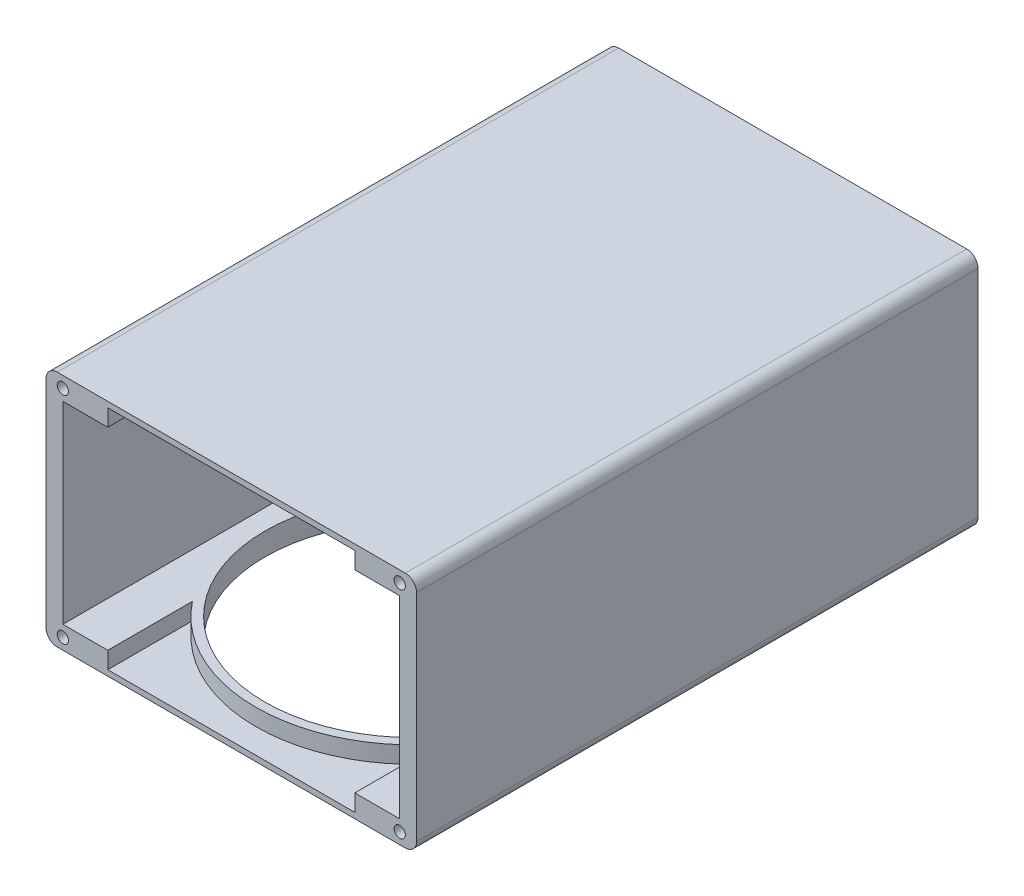
ISO-10303-21;
HEADER;
FILE_DESCRIPTION(('STEP AP214'),'2;1');
FILE_NAME('part.step','',(''),(''),'','','');
FILE_SCHEMA(('AUTOMOTIVE_DESIGN { 1 0 10303 214 1 1 1 1 }'));
ENDSEC;
DATA;
#1=APPLICATION_CONTEXT('core data for automotive mechanical design processes');
#2=APPLICATION_PROTOCOL_DEFINITION('international standard','automotive_design',2000,#1);
#3=PRODUCT_CONTEXT('',#1,'mechanical');
#4=PRODUCT('Part','Part','',(#3));
#5=PRODUCT_RELATED_PRODUCT_CATEGORY('part','',(#4));
#6=PRODUCT_DEFINITION_FORMATION('','',#4);
#7=PRODUCT_DEFINITION_CONTEXT('part definition',#1,'design');
#8=PRODUCT_DEFINITION('design','',#6,#7);
#9=PRODUCT_DEFINITION_SHAPE('','',#8);
#10=(LENGTH_UNIT() NAMED_UNIT(*) SI_UNIT(.MILLI.,.METRE.));
#11=(NAMED_UNIT(*) PLANE_ANGLE_UNIT() SI_UNIT($,.RADIAN.));
#12=(NAMED_UNIT(*) SI_UNIT($,.STERADIAN.) SOLID_ANGLE_UNIT());
#13=UNCERTAINTY_MEASURE_WITH_UNIT(LENGTH_MEASURE(1.E-05),#10,'distance_accuracy_value','');
#14=(GEOMETRIC_REPRESENTATION_CONTEXT(3) GLOBAL_UNCERTAINTY_ASSIGNED_CONTEXT((#13)) GLOBAL_UNIT_ASSIGNED_CONTEXT((#10,
#11,#12)) REPRESENTATION_CONTEXT('',''));
#15=CARTESIAN_POINT('',(0.,0.,0.));
#16=DIRECTION('',(0.,0.,1.));
#17=DIRECTION('',(1.,0.,0.));
#18=AXIS2_PLACEMENT_3D('',#15,#16,#17);
#19=CARTESIAN_POINT('',(0.,0.,0.));
#20=DIRECTION('',(0.,0.,1.));
#21=DIRECTION('',(1.,0.,0.));
#22=AXIS2_PLACEMENT_3D('',#19,#20,#21);
#23=PLANE('',#22);
#24=CARTESIAN_POINT('',(152.5,-4.99999999999999,0.));
#25=DIRECTION('',(0.,0.,1.));
#26=DIRECTION('',(1.,0.,0.));
#27=AXIS2_PLACEMENT_3D('',#24,#25,#26);
#28=CIRCLE('',#27,5.);
#29=CARTESIAN_POINT('',(152.5,-9.99999999999999,0.));
#30=VERTEX_POINT('',#29);
#31=CARTESIAN_POINT('',(157.5,-4.99999999999999,0.));
#32=VERTEX_POINT('',#31);
#33=EDGE_CURVE('E263',#30,#32,#28,.T.);
#34=ORIENTED_EDGE('',*,*,#33,.T.);
#35=DIRECTION('',(0.,1.,0.));
#36=VECTOR('',#35,1.);
#37=CARTESIAN_POINT('',(157.5,0.,0.));
#38=LINE('',#37,#36);
#39=CARTESIAN_POINT('',(157.5,91.,0.));
#40=VERTEX_POINT('',#39);
#41=EDGE_CURVE('E310',#32,#40,#38,.T.);
#42=ORIENTED_EDGE('',*,*,#41,.T.);
#43=CARTESIAN_POINT('',(152.5,91.,0.));
#44=DIRECTION('',(0.,0.,1.));
#45=DIRECTION('',(1.,0.,0.));
#46=AXIS2_PLACEMENT_3D('',#43,#44,#45);
#47=CIRCLE('',#46,5.);
#48=CARTESIAN_POINT('',(152.5,96.,0.));
#49=VERTEX_POINT('',#48);
#50=EDGE_CURVE('E420',#40,#49,#47,.T.);
#51=ORIENTED_EDGE('',*,*,#50,.T.);
#52=DIRECTION('',(1.,0.,0.));
#53=VECTOR('',#52,1.);
#54=CARTESIAN_POINT('',(0.,96.,0.));
#55=LINE('',#54,#53);
#56=CARTESIAN_POINT('',(-2.5,96.,0.));
#57=VERTEX_POINT('',#56);
#58=EDGE_CURVE('E362',#57,#49,#55,.T.);
#59=ORIENTED_EDGE('',*,*,#58,.F.);
#60=CARTESIAN_POINT('',(-2.5,91.,0.));
#61=DIRECTION('',(0.,0.,1.));
#62=DIRECTION('',(1.,0.,0.));
#63=AXIS2_PLACEMENT_3D('',#60,#61,#62);
#64=CIRCLE('',#63,5.);
#65=CARTESIAN_POINT('',(-7.5,91.,0.));
#66=VERTEX_POINT('',#65);
#67=EDGE_CURVE('E423',#57,#66,#64,.T.);
#68=ORIENTED_EDGE('',*,*,#67,.T.);
#69=DIRECTION('',(0.,1.,0.));
#70=VECTOR('',#69,1.);
#71=CARTESIAN_POINT('',(-7.5,0.,0.));
#72=LINE('',#71,#70);
#73=CARTESIAN_POINT('',(-7.5,-5.,0.));
#74=VERTEX_POINT('',#73);
#75=EDGE_CURVE('E366',#74,#66,#72,.T.);
#76=ORIENTED_EDGE('',*,*,#75,.F.);
#77=CARTESIAN_POINT('',(-2.5,-5.,0.));
#78=DIRECTION('',(0.,0.,1.));
#79=DIRECTION('',(1.,0.,0.));
#80=AXIS2_PLACEMENT_3D('',#77,#78,#79);
#81=CIRCLE('',#80,5.);
#82=CARTESIAN_POINT('',(-2.5,-10.,0.));
#83=VERTEX_POINT('',#82);
#84=EDGE_CURVE('E268',#74,#83,#81,.T.);
#85=ORIENTED_EDGE('',*,*,#84,.T.);
#86=DIRECTION('',(-1.,0.,0.));
#87=VECTOR('',#86,1.);
#88=CARTESIAN_POINT('',(0.,-10.,0.));
#89=LINE('',#88,#87);
#90=EDGE_CURVE('E452',#30,#83,#89,.T.);
#91=ORIENTED_EDGE('',*,*,#90,.F.);
#92=EDGE_LOOP('',(#34,#42,#51,#59,#68,#76,#85,#91));
#93=FACE_BOUND('',#92,.T.);
#94=CARTESIAN_POINT('',(150.,91.,0.));
#95=DIRECTION('',(0.,0.,-1.));
#96=DIRECTION('',(-1.,0.,0.));
#97=AXIS2_PLACEMENT_3D('',#94,#95,#96);
#98=CIRCLE('',#97,2.5);
#99=CARTESIAN_POINT('',(147.5,91.,0.));
#100=VERTEX_POINT('',#99);
#101=EDGE_CURVE('E299',#100,#100,#98,.T.);
#102=ORIENTED_EDGE('',*,*,#101,.T.);
#103=EDGE_LOOP('',(#102));
#104=FACE_BOUND('',#103,.T.);
#105=DIRECTION('',(0.,1.,0.));
#106=VECTOR('',#105,1.);
#107=CARTESIAN_POINT('',(150.,0.,0.));
#108=LINE('',#107,#106);
#109=CARTESIAN_POINT('',(150.,0.,0.));
#110=VERTEX_POINT('',#109);
#111=CARTESIAN_POINT('',(150.,86.,0.));
#112=VERTEX_POINT('',#111);
#113=EDGE_CURVE('E326',#110,#112,#108,.T.);
#114=ORIENTED_EDGE('',*,*,#113,.F.);
#115=DIRECTION('',(1.,0.,0.));
#116=VECTOR('',#115,1.);
#117=CARTESIAN_POINT('',(0.,0.,0.));
#118=LINE('',#117,#116);
#119=CARTESIAN_POINT('',(130.,0.,0.));
#120=VERTEX_POINT('',#119);
#121=EDGE_CURVE('E459',#120,#110,#118,.T.);
#122=ORIENTED_EDGE('',*,*,#121,.F.);
#123=DIRECTION('',(0.,1.,0.));
#124=VECTOR('',#123,1.);
#125=CARTESIAN_POINT('',(130.,0.,0.));
#126=LINE('',#125,#124);
#127=CARTESIAN_POINT('',(130.,-7.49999999999999,0.));
#128=VERTEX_POINT('',#127);
#129=EDGE_CURVE('E465',#128,#120,#126,.T.);
#130=ORIENTED_EDGE('',*,*,#129,.F.);
#131=DIRECTION('',(1.,0.,0.));
#132=VECTOR('',#131,1.);
#133=CARTESIAN_POINT('',(0.,-7.5,0.));
#134=LINE('',#133,#132);
#135=CARTESIAN_POINT('',(20.,-7.5,0.));
#136=VERTEX_POINT('',#135);
#137=EDGE_CURVE('E478',#136,#128,#134,.T.);
#138=ORIENTED_EDGE('',*,*,#137,.F.);
#139=DIRECTION('',(0.,1.,0.));
#140=VECTOR('',#139,1.);
#141=CARTESIAN_POINT('',(20.,0.,0.));
#142=LINE('',#141,#140);
#143=CARTESIAN_POINT('',(20.,0.,0.));
#144=VERTEX_POINT('',#143);
#145=EDGE_CURVE('E482',#136,#144,#142,.T.);
#146=ORIENTED_EDGE('',*,*,#145,.T.);
#147=CARTESIAN_POINT('',(0.,0.,0.));
#148=VERTEX_POINT('',#147);
#149=EDGE_CURVE('E467',#148,#144,#118,.T.);
#150=ORIENTED_EDGE('',*,*,#149,.F.);
#151=DIRECTION('',(0.,1.,0.));
#152=VECTOR('',#151,1.);
#153=CARTESIAN_POINT('',(0.,0.,0.));
#154=LINE('',#153,#152);
#155=CARTESIAN_POINT('',(0.,86.,0.));
#156=VERTEX_POINT('',#155);
#157=EDGE_CURVE('E369',#148,#156,#154,.T.);
#158=ORIENTED_EDGE('',*,*,#157,.T.);
#159=DIRECTION('',(1.,0.,0.));
#160=VECTOR('',#159,1.);
#161=CARTESIAN_POINT('',(0.,86.,0.));
#162=LINE('',#161,#160);
#163=CARTESIAN_POINT('',(20.,86.,0.));
#164=VERTEX_POINT('',#163);
#165=EDGE_CURVE('E373',#156,#164,#162,.T.);
#166=ORIENTED_EDGE('',*,*,#165,.T.);
#167=DIRECTION('',(0.,-1.,0.));
#168=VECTOR('',#167,1.);
#169=CARTESIAN_POINT('',(20.,0.,0.));
#170=LINE('',#169,#168);
#171=CARTESIAN_POINT('',(20.,93.5,0.));
#172=VERTEX_POINT('',#171);
#173=EDGE_CURVE('E377',#172,#164,#170,.T.);
#174=ORIENTED_EDGE('',*,*,#173,.F.);
#175=DIRECTION('',(1.,0.,0.));
#176=VECTOR('',#175,1.);
#177=CARTESIAN_POINT('',(0.,93.5,0.));
#178=LINE('',#177,#176);
#179=CARTESIAN_POINT('',(130.,93.5,0.));
#180=VERTEX_POINT('',#179);
#181=EDGE_CURVE('E381',#172,#180,#178,.T.);
#182=ORIENTED_EDGE('',*,*,#181,.T.);
#183=DIRECTION('',(0.,-1.,0.));
#184=VECTOR('',#183,1.);
#185=CARTESIAN_POINT('',(130.,0.,0.));
#186=LINE('',#185,#184);
#187=CARTESIAN_POINT('',(130.,86.,0.));
#188=VERTEX_POINT('',#187);
#189=EDGE_CURVE('E385',#180,#188,#186,.T.);
#190=ORIENTED_EDGE('',*,*,#189,.T.);
#191=DIRECTION('',(1.,0.,0.));
#192=VECTOR('',#191,1.);
#193=CARTESIAN_POINT('',(0.,86.,0.));
#194=LINE('',#193,#192);
#195=EDGE_CURVE('E389',#188,#112,#194,.T.);
#196=ORIENTED_EDGE('',*,*,#195,.T.);
#197=EDGE_LOOP('',(#114,#122,#130,#138,#146,#150,#158,#166,#174,#182,#190,#196));
#198=FACE_BOUND('',#197,.T.);
#199=CARTESIAN_POINT('',(0.,91.,0.));
#200=DIRECTION('',(0.,0.,1.));
#201=DIRECTION('',(1.,0.,0.));
#202=AXIS2_PLACEMENT_3D('',#199,#200,#201);
#203=CIRCLE('',#202,2.5);
#204=CARTESIAN_POINT('',(2.5,91.,0.));
#205=VERTEX_POINT('',#204);
#206=EDGE_CURVE('E295',#205,#205,#203,.T.);
#207=ORIENTED_EDGE('',*,*,#206,.F.);
#208=EDGE_LOOP('',(#207));
#209=FACE_BOUND('',#208,.T.);
#210=CARTESIAN_POINT('',(150.,-5.,0.));
#211=DIRECTION('',(0.,0.,1.));
#212=DIRECTION('',(1.,0.,0.));
#213=AXIS2_PLACEMENT_3D('',#210,#211,#212);
#214=CIRCLE('',#213,2.5);
#215=CARTESIAN_POINT('',(152.5,-5.,0.));
#216=VERTEX_POINT('',#215);
#217=EDGE_CURVE('E577',#216,#216,#214,.T.);
#218=ORIENTED_EDGE('',*,*,#217,.F.);
#219=EDGE_LOOP('',(#218));
#220=FACE_BOUND('',#219,.T.);
#221=CARTESIAN_POINT('',(0.,-5.,0.));
#222=DIRECTION('',(0.,0.,-1.));
#223=DIRECTION('',(-1.,0.,0.));
#224=AXIS2_PLACEMENT_3D('',#221,#222,#223);
#225=CIRCLE('',#224,2.5);
#226=CARTESIAN_POINT('',(-2.5,-5.,0.));
#227=VERTEX_POINT('',#226);
#228=EDGE_CURVE('E562',#227,#227,#225,.T.);
#229=ORIENTED_EDGE('',*,*,#228,.T.);
#230=EDGE_LOOP('',(#229));
#231=FACE_BOUND('',#230,.T.);
#232=ADVANCED_FACE('F49',(#93,#104,#198,#209,#220,#231),#23,.T.);
#233=CARTESIAN_POINT('',(150.,0.,-250.));
#234=DIRECTION('',(1.,0.,0.));
#235=DIRECTION('',(0.,0.,-1.));
#236=AXIS2_PLACEMENT_3D('',#233,#234,#235);
#237=PLANE('',#236);
#238=ORIENTED_EDGE('',*,*,#113,.T.);
#239=DIRECTION('',(0.,0.,1.));
#240=VECTOR('',#239,1.);
#241=CARTESIAN_POINT('',(150.,86.,-250.));
#242=LINE('',#241,#240);
#243=CARTESIAN_POINT('',(150.,86.,-250.));
#244=VERTEX_POINT('',#243);
#245=EDGE_CURVE('E396',#244,#112,#242,.T.);
#246=ORIENTED_EDGE('',*,*,#245,.F.);
#247=DIRECTION('',(0.,1.,0.));
#248=VECTOR('',#247,1.);
#249=CARTESIAN_POINT('',(150.,0.,-250.));
#250=LINE('',#249,#248);
#251=CARTESIAN_POINT('',(150.,0.,-250.));
#252=VERTEX_POINT('',#251);
#253=EDGE_CURVE('E355',#252,#244,#250,.T.);
#254=ORIENTED_EDGE('',*,*,#253,.F.);
#255=DIRECTION('',(0.,0.,1.));
#256=VECTOR('',#255,1.);
#257=CARTESIAN_POINT('',(150.,0.,-250.));
#258=LINE('',#257,#256);
#259=EDGE_CURVE('E252',#252,#110,#258,.T.);
#260=ORIENTED_EDGE('',*,*,#259,.T.);
#261=EDGE_LOOP('',(#238,#246,#254,#260));
#262=FACE_BOUND('',#261,.T.);
#263=ADVANCED_FACE('F606',(#262),#237,.F.);
#264=CARTESIAN_POINT('',(0.,86.,-250.));
#265=DIRECTION('',(0.,-1.,0.));
#266=DIRECTION('',(0.,0.,-1.));
#267=AXIS2_PLACEMENT_3D('',#264,#265,#266);
#268=PLANE('',#267);
#269=ORIENTED_EDGE('',*,*,#195,.F.);
#270=DIRECTION('',(0.,0.,1.));
#271=VECTOR('',#270,1.);
#272=CARTESIAN_POINT('',(130.,86.,-250.));
#273=LINE('',#272,#271);
#274=CARTESIAN_POINT('',(130.,86.,-250.));
#275=VERTEX_POINT('',#274);
#276=EDGE_CURVE('E400',#275,#188,#273,.T.);
#277=ORIENTED_EDGE('',*,*,#276,.F.);
#278=DIRECTION('',(1.,0.,0.));
#279=VECTOR('',#278,1.);
#280=CARTESIAN_POINT('',(0.,86.,-250.));
#281=LINE('',#280,#279);
#282=EDGE_CURVE('E351',#275,#244,#281,.T.);
#283=ORIENTED_EDGE('',*,*,#282,.T.);
#284=ORIENTED_EDGE('',*,*,#245,.T.);
#285=EDGE_LOOP('',(#269,#277,#283,#284));
#286=FACE_BOUND('',#285,.T.);
#287=ADVANCED_FACE('F612',(#286),#268,.T.);
#288=CARTESIAN_POINT('',(130.,0.,-250.));
#289=DIRECTION('',(-1.,0.,0.));
#290=DIRECTION('',(0.,0.,1.));
#291=AXIS2_PLACEMENT_3D('',#288,#289,#290);
#292=PLANE('',#291);
#293=ORIENTED_EDGE('',*,*,#189,.F.);
#294=DIRECTION('',(0.,0.,1.));
#295=VECTOR('',#294,1.);
#296=CARTESIAN_POINT('',(130.,93.5,-250.));
#297=LINE('',#296,#295);
#298=CARTESIAN_POINT('',(130.,93.5,-250.));
#299=VERTEX_POINT('',#298);
#300=EDGE_CURVE('E403',#299,#180,#297,.T.);
#301=ORIENTED_EDGE('',*,*,#300,.F.);
#302=DIRECTION('',(0.,-1.,0.));
#303=VECTOR('',#302,1.);
#304=CARTESIAN_POINT('',(130.,0.,-250.));
#305=LINE('',#304,#303);
#306=EDGE_CURVE('E347',#299,#275,#305,.T.);
#307=ORIENTED_EDGE('',*,*,#306,.T.);
#308=ORIENTED_EDGE('',*,*,#276,.T.);
#309=EDGE_LOOP('',(#293,#301,#307,#308));
#310=FACE_BOUND('',#309,.T.);
#311=ADVANCED_FACE('F620',(#310),#292,.T.);
#312=CARTESIAN_POINT('',(0.,93.5,-250.));
#313=DIRECTION('',(0.,-1.,0.));
#314=DIRECTION('',(1.,0.,0.));
#315=AXIS2_PLACEMENT_3D('',#312,#313,#314);
#316=PLANE('',#315);
#317=ORIENTED_EDGE('',*,*,#181,.F.);
#318=DIRECTION('',(0.,0.,1.));
#319=VECTOR('',#318,1.);
#320=CARTESIAN_POINT('',(20.,93.5,-250.));
#321=LINE('',#320,#319);
#322=CARTESIAN_POINT('',(20.,93.5,-250.));
#323=VERTEX_POINT('',#322);
#324=EDGE_CURVE('E406',#323,#172,#321,.T.);
#325=ORIENTED_EDGE('',*,*,#324,.F.);
#326=DIRECTION('',(1.,0.,0.));
#327=VECTOR('',#326,1.);
#328=CARTESIAN_POINT('',(0.,93.5,-250.));
#329=LINE('',#328,#327);
#330=EDGE_CURVE('E343',#323,#299,#329,.T.);
#331=ORIENTED_EDGE('',*,*,#330,.T.);
#332=ORIENTED_EDGE('',*,*,#300,.T.);
#333=EDGE_LOOP('',(#317,#325,#331,#332));
#334=FACE_BOUND('',#333,.T.);
#335=ADVANCED_FACE('F624',(#334),#316,.T.);
#336=CARTESIAN_POINT('',(20.,0.,-250.));
#337=DIRECTION('',(-1.,0.,0.));
#338=DIRECTION('',(0.,0.,1.));
#339=AXIS2_PLACEMENT_3D('',#336,#337,#338);
#340=PLANE('',#339);
#341=ORIENTED_EDGE('',*,*,#173,.T.);
#342=DIRECTION('',(0.,0.,1.));
#343=VECTOR('',#342,1.);
#344=CARTESIAN_POINT('',(20.,86.,-250.));
#345=LINE('',#344,#343);
#346=CARTESIAN_POINT('',(20.,86.,-250.));
#347=VERTEX_POINT('',#346);
#348=EDGE_CURVE('E409',#347,#164,#345,.T.);
#349=ORIENTED_EDGE('',*,*,#348,.F.);
#350=DIRECTION('',(0.,-1.,0.));
#351=VECTOR('',#350,1.);
#352=CARTESIAN_POINT('',(20.,0.,-250.));
#353=LINE('',#352,#351);
#354=EDGE_CURVE('E340',#323,#347,#353,.T.);
#355=ORIENTED_EDGE('',*,*,#354,.F.);
#356=ORIENTED_EDGE('',*,*,#324,.T.);
#357=EDGE_LOOP('',(#341,#349,#355,#356));
#358=FACE_BOUND('',#357,.T.);
#359=ADVANCED_FACE('F628',(#358),#340,.F.);
#360=CARTESIAN_POINT('',(0.,86.,-250.));
#361=DIRECTION('',(0.,-1.,0.));
#362=DIRECTION('',(0.,0.,-1.));
#363=AXIS2_PLACEMENT_3D('',#360,#361,#362);
#364=PLANE('',#363);
#365=ORIENTED_EDGE('',*,*,#165,.F.);
#366=DIRECTION('',(0.,0.,1.));
#367=VECTOR('',#366,1.);
#368=CARTESIAN_POINT('',(0.,86.,-250.));
#369=LINE('',#368,#367);
#370=CARTESIAN_POINT('',(0.,86.,-250.));
#371=VERTEX_POINT('',#370);
#372=EDGE_CURVE('E358',#371,#156,#369,.T.);
#373=ORIENTED_EDGE('',*,*,#372,.F.);
#374=DIRECTION('',(1.,0.,0.));
#375=VECTOR('',#374,1.);
#376=CARTESIAN_POINT('',(0.,86.,-250.));
#377=LINE('',#376,#375);
#378=EDGE_CURVE('E336',#371,#347,#377,.T.);
#379=ORIENTED_EDGE('',*,*,#378,.T.);
#380=ORIENTED_EDGE('',*,*,#348,.T.);
#381=EDGE_LOOP('',(#365,#373,#379,#380));
#382=FACE_BOUND('',#381,.T.);
#383=ADVANCED_FACE('F632',(#382),#364,.T.);
#384=CARTESIAN_POINT('',(0.,0.,-250.));
#385=DIRECTION('',(1.,0.,0.));
#386=DIRECTION('',(0.,0.,-1.));
#387=AXIS2_PLACEMENT_3D('',#384,#385,#386);
#388=PLANE('',#387);
#389=ORIENTED_EDGE('',*,*,#157,.F.);
#390=DIRECTION('',(0.,0.,1.));
#391=VECTOR('',#390,1.);
#392=CARTESIAN_POINT('',(0.,0.,-250.));
#393=LINE('',#392,#391);
#394=CARTESIAN_POINT('',(0.,0.,-250.));
#395=VERTEX_POINT('',#394);
#396=EDGE_CURVE('E264',#395,#148,#393,.T.);
#397=ORIENTED_EDGE('',*,*,#396,.F.);
#398=DIRECTION('',(0.,1.,0.));
#399=VECTOR('',#398,1.);
#400=CARTESIAN_POINT('',(0.,0.,-250.));
#401=LINE('',#400,#399);
#402=EDGE_CURVE('E332',#395,#371,#401,.T.);
#403=ORIENTED_EDGE('',*,*,#402,.T.);
#404=ORIENTED_EDGE('',*,*,#372,.T.);
#405=EDGE_LOOP('',(#389,#397,#403,#404));
#406=FACE_BOUND('',#405,.T.);
#407=ADVANCED_FACE('F636',(#406),#388,.T.);
#408=CARTESIAN_POINT('',(-7.5,0.,-250.));
#409=DIRECTION('',(1.,0.,0.));
#410=DIRECTION('',(0.,0.,-1.));
#411=AXIS2_PLACEMENT_3D('',#408,#409,#410);
#412=PLANE('',#411);
#413=ORIENTED_EDGE('',*,*,#75,.T.);
#414=DIRECTION('',(0.,0.,1.));
#415=VECTOR('',#414,1.);
#416=CARTESIAN_POINT('',(-7.5,91.,-250.));
#417=LINE('',#416,#415);
#418=CARTESIAN_POINT('',(-7.5,91.,-250.));
#419=VERTEX_POINT('',#418);
#420=EDGE_CURVE('E73',#66,#419,#417,.F.);
#421=ORIENTED_EDGE('',*,*,#420,.T.);
#422=DIRECTION('',(0.,1.,0.));
#423=VECTOR('',#422,1.);
#424=CARTESIAN_POINT('',(-7.5,0.,-250.));
#425=LINE('',#424,#423);
#426=CARTESIAN_POINT('',(-7.5,-5.,-250.));
#427=VERTEX_POINT('',#426);
#428=EDGE_CURVE('E329',#427,#419,#425,.T.);
#429=ORIENTED_EDGE('',*,*,#428,.F.);
#430=DIRECTION('',(0.,0.,1.));
#431=VECTOR('',#430,1.);
#432=CARTESIAN_POINT('',(-7.5,-5.,0.));
#433=LINE('',#432,#431);
#434=EDGE_CURVE('E259',#427,#74,#433,.T.);
#435=ORIENTED_EDGE('',*,*,#434,.T.);
#436=EDGE_LOOP('',(#413,#421,#429,#435));
#437=FACE_BOUND('',#436,.T.);
#438=ADVANCED_FACE('F444',(#437),#412,.F.);
#439=CARTESIAN_POINT('',(0.,96.,-250.));
#440=DIRECTION('',(0.,-1.,0.));
#441=DIRECTION('',(0.,0.,-1.));
#442=AXIS2_PLACEMENT_3D('',#439,#440,#441);
#443=PLANE('',#442);
#444=DIRECTION('',(1.,0.,0.));
#445=VECTOR('',#444,1.);
#446=CARTESIAN_POINT('',(0.,96.,-250.));
#447=LINE('',#446,#445);
#448=CARTESIAN_POINT('',(-2.5,96.,-250.));
#449=VERTEX_POINT('',#448);
#450=CARTESIAN_POINT('',(152.5,96.,-250.));
#451=VERTEX_POINT('',#450);
#452=EDGE_CURVE('E325',#449,#451,#447,.T.);
#453=ORIENTED_EDGE('',*,*,#452,.F.);
#454=DIRECTION('',(0.,0.,1.));
#455=VECTOR('',#454,1.);
#456=CARTESIAN_POINT('',(-2.5,96.,-250.));
#457=LINE('',#456,#455);
#458=EDGE_CURVE('E416',#449,#57,#457,.T.);
#459=ORIENTED_EDGE('',*,*,#458,.T.);
#460=ORIENTED_EDGE('',*,*,#58,.T.);
#461=DIRECTION('',(0.,0.,1.));
#462=VECTOR('',#461,1.);
#463=CARTESIAN_POINT('',(152.5,96.,-250.));
#464=LINE('',#463,#462);
#465=EDGE_CURVE('E399',#49,#451,#464,.F.);
#466=ORIENTED_EDGE('',*,*,#465,.T.);
#467=EDGE_LOOP('',(#453,#459,#460,#466));
#468=FACE_BOUND('',#467,.T.);
#469=ADVANCED_FACE('F437',(#468),#443,.F.);
#470=CARTESIAN_POINT('',(157.5,0.,-250.));
#471=DIRECTION('',(1.,0.,0.));
#472=DIRECTION('',(0.,0.,-1.));
#473=AXIS2_PLACEMENT_3D('',#470,#471,#472);
#474=PLANE('',#473);
#475=DIRECTION('',(0.,1.,0.));
#476=VECTOR('',#475,1.);
#477=CARTESIAN_POINT('',(157.5,0.,-250.));
#478=LINE('',#477,#476);
#479=CARTESIAN_POINT('',(157.5,-4.99999999999999,-250.));
#480=VERTEX_POINT('',#479);
#481=CARTESIAN_POINT('',(157.5,91.,-250.));
#482=VERTEX_POINT('',#481);
#483=EDGE_CURVE('E322',#480,#482,#478,.T.);
#484=ORIENTED_EDGE('',*,*,#483,.T.);
#485=DIRECTION('',(0.,0.,1.));
#486=VECTOR('',#485,1.);
#487=CARTESIAN_POINT('',(157.5,91.,0.));
#488=LINE('',#487,#486);
#489=EDGE_CURVE('E11',#482,#40,#488,.T.);
#490=ORIENTED_EDGE('',*,*,#489,.T.);
#491=ORIENTED_EDGE('',*,*,#41,.F.);
#492=DIRECTION('',(0.,0.,1.));
#493=VECTOR('',#492,1.);
#494=CARTESIAN_POINT('',(157.5,-4.99999999999999,-250.));
#495=LINE('',#494,#493);
#496=EDGE_CURVE('E285',#32,#480,#495,.F.);
#497=ORIENTED_EDGE('',*,*,#496,.T.);
#498=EDGE_LOOP('',(#484,#490,#491,#497));
#499=FACE_BOUND('',#498,.T.);
#500=ADVANCED_FACE('F645',(#499),#474,.T.);
#501=CARTESIAN_POINT('',(0.,0.,-250.));
#502=DIRECTION('',(0.,0.,1.));
#503=DIRECTION('',(1.,0.,0.));
#504=AXIS2_PLACEMENT_3D('',#501,#502,#503);
#505=PLANE('',#504);
#506=ORIENTED_EDGE('',*,*,#483,.F.);
#507=CARTESIAN_POINT('',(152.5,-4.99999999999999,-250.));
#508=DIRECTION('',(0.,0.,1.));
#509=DIRECTION('',(1.,0.,0.));
#510=AXIS2_PLACEMENT_3D('',#507,#508,#509);
#511=CIRCLE('',#510,5.);
#512=CARTESIAN_POINT('',(152.5,-9.99999999999999,-250.));
#513=VERTEX_POINT('',#512);
#514=EDGE_CURVE('E278',#480,#513,#511,.F.);
#515=ORIENTED_EDGE('',*,*,#514,.T.);
#516=DIRECTION('',(-1.,0.,0.));
#517=VECTOR('',#516,1.);
#518=CARTESIAN_POINT('',(0.,-10.,-250.));
#519=LINE('',#518,#517);
#520=CARTESIAN_POINT('',(-2.5,-10.,-250.));
#521=VERTEX_POINT('',#520);
#522=EDGE_CURVE('E523',#513,#521,#519,.T.);
#523=ORIENTED_EDGE('',*,*,#522,.T.);
#524=CARTESIAN_POINT('',(-2.5,-5.,-250.));
#525=DIRECTION('',(0.,0.,1.));
#526=DIRECTION('',(1.,0.,0.));
#527=AXIS2_PLACEMENT_3D('',#524,#525,#526);
#528=CIRCLE('',#527,5.);
#529=EDGE_CURVE('E281',#521,#427,#528,.F.);
#530=ORIENTED_EDGE('',*,*,#529,.T.);
#531=ORIENTED_EDGE('',*,*,#428,.T.);
#532=CARTESIAN_POINT('',(-2.5,91.,-250.));
#533=DIRECTION('',(0.,0.,1.));
#534=DIRECTION('',(1.,0.,0.));
#535=AXIS2_PLACEMENT_3D('',#532,#533,#534);
#536=CIRCLE('',#535,5.);
#537=EDGE_CURVE('E58',#419,#449,#536,.F.);
#538=ORIENTED_EDGE('',*,*,#537,.T.);
#539=ORIENTED_EDGE('',*,*,#452,.T.);
#540=CARTESIAN_POINT('',(152.5,91.,-250.));
#541=DIRECTION('',(0.,0.,1.));
#542=DIRECTION('',(1.,0.,0.));
#543=AXIS2_PLACEMENT_3D('',#540,#541,#542);
#544=CIRCLE('',#543,5.);
#545=EDGE_CURVE('E65',#451,#482,#544,.F.);
#546=ORIENTED_EDGE('',*,*,#545,.T.);
#547=EDGE_LOOP('',(#506,#515,#523,#530,#531,#538,#539,#546));
#548=FACE_BOUND('',#547,.T.);
#549=CARTESIAN_POINT('',(0.,91.,-250.));
#550=DIRECTION('',(0.,0.,-1.));
#551=DIRECTION('',(-1.,0.,0.));
#552=AXIS2_PLACEMENT_3D('',#549,#550,#551);
#553=CIRCLE('',#552,2.5);
#554=CARTESIAN_POINT('',(-2.5,91.,-250.));
#555=VERTEX_POINT('',#554);
#556=EDGE_CURVE('E311',#555,#555,#553,.T.);
#557=ORIENTED_EDGE('',*,*,#556,.F.);
#558=EDGE_LOOP('',(#557));
#559=FACE_BOUND('',#558,.T.);
#560=CARTESIAN_POINT('',(150.,91.,-250.));
#561=DIRECTION('',(0.,0.,-1.));
#562=DIRECTION('',(1.,0.,0.));
#563=AXIS2_PLACEMENT_3D('',#560,#561,#562);
#564=CIRCLE('',#563,2.5);
#565=CARTESIAN_POINT('',(152.5,91.,-250.));
#566=VERTEX_POINT('',#565);
#567=EDGE_CURVE('E315',#566,#566,#564,.T.);
#568=ORIENTED_EDGE('',*,*,#567,.F.);
#569=EDGE_LOOP('',(#568));
#570=FACE_BOUND('',#569,.T.);
#571=DIRECTION('',(1.,0.,0.));
#572=VECTOR('',#571,1.);
#573=CARTESIAN_POINT('',(0.,0.,-250.));
#574=LINE('',#573,#572);
#575=CARTESIAN_POINT('',(130.,0.,-250.));
#576=VERTEX_POINT('',#575);
#577=EDGE_CURVE('E244',#576,#252,#574,.T.);
#578=ORIENTED_EDGE('',*,*,#577,.T.);
#579=ORIENTED_EDGE('',*,*,#253,.T.);
#580=ORIENTED_EDGE('',*,*,#282,.F.);
#581=ORIENTED_EDGE('',*,*,#306,.F.);
#582=ORIENTED_EDGE('',*,*,#330,.F.);
#583=ORIENTED_EDGE('',*,*,#354,.T.);
#584=ORIENTED_EDGE('',*,*,#378,.F.);
#585=ORIENTED_EDGE('',*,*,#402,.F.);
#586=CARTESIAN_POINT('',(20.,0.,-250.));
#587=VERTEX_POINT('',#586);
#588=EDGE_CURVE('E258',#395,#587,#574,.T.);
#589=ORIENTED_EDGE('',*,*,#588,.T.);
#590=DIRECTION('',(0.,1.,0.));
#591=VECTOR('',#590,1.);
#592=CARTESIAN_POINT('',(20.,0.,-250.));
#593=LINE('',#592,#591);
#594=CARTESIAN_POINT('',(20.,-7.5,-250.));
#595=VERTEX_POINT('',#594);
#596=EDGE_CURVE('E472',#595,#587,#593,.T.);
#597=ORIENTED_EDGE('',*,*,#596,.F.);
#598=DIRECTION('',(1.,0.,0.));
#599=VECTOR('',#598,1.);
#600=CARTESIAN_POINT('',(0.,-7.5,-250.));
#601=LINE('',#600,#599);
#602=CARTESIAN_POINT('',(130.,-7.49999999999999,-250.));
#603=VERTEX_POINT('',#602);
#604=EDGE_CURVE('E532',#595,#603,#601,.T.);
#605=ORIENTED_EDGE('',*,*,#604,.T.);
#606=DIRECTION('',(0.,1.,0.));
#607=VECTOR('',#606,1.);
#608=CARTESIAN_POINT('',(130.,0.,-250.));
#609=LINE('',#608,#607);
#610=EDGE_CURVE('E527',#603,#576,#609,.T.);
#611=ORIENTED_EDGE('',*,*,#610,.T.);
#612=EDGE_LOOP('',(#578,#579,#580,#581,#582,#583,#584,#585,#589,#597,#605,#611));
#613=FACE_BOUND('',#612,.T.);
#614=CARTESIAN_POINT('',(0.,-5.,-250.));
#615=DIRECTION('',(0.,0.,-1.));
#616=DIRECTION('',(1.,0.,0.));
#617=AXIS2_PLACEMENT_3D('',#614,#615,#616);
#618=CIRCLE('',#617,2.5);
#619=CARTESIAN_POINT('',(2.5,-5.,-250.));
#620=VERTEX_POINT('',#619);
#621=EDGE_CURVE('E225',#620,#620,#618,.T.);
#622=ORIENTED_EDGE('',*,*,#621,.F.);
#623=EDGE_LOOP('',(#622));
#624=FACE_BOUND('',#623,.T.);
#625=CARTESIAN_POINT('',(150.,-5.,-250.));
#626=DIRECTION('',(0.,0.,-1.));
#627=DIRECTION('',(-1.,0.,0.));
#628=AXIS2_PLACEMENT_3D('',#625,#626,#627);
#629=CIRCLE('',#628,2.5);
#630=CARTESIAN_POINT('',(147.5,-5.,-250.));
#631=VERTEX_POINT('',#630);
#632=EDGE_CURVE('E561',#631,#631,#629,.T.);
#633=ORIENTED_EDGE('',*,*,#632,.F.);
#634=EDGE_LOOP('',(#633));
#635=FACE_BOUND('',#634,.T.);
#636=ADVANCED_FACE('F432',(#548,#559,#570,#613,#624,#635),#505,.F.);
#637=CARTESIAN_POINT('',(-2.5,91.,-250.));
#638=DIRECTION('',(0.,0.,1.));
#639=DIRECTION('',(1.,0.,0.));
#640=AXIS2_PLACEMENT_3D('',#637,#638,#639);
#641=CYLINDRICAL_SURFACE('',#640,5.);
#642=ORIENTED_EDGE('',*,*,#537,.F.);
#643=ORIENTED_EDGE('',*,*,#420,.F.);
#644=ORIENTED_EDGE('',*,*,#67,.F.);
#645=ORIENTED_EDGE('',*,*,#458,.F.);
#646=EDGE_LOOP('',(#642,#643,#644,#645));
#647=FACE_BOUND('',#646,.T.);
#648=ADVANCED_FACE('F440',(#647),#641,.T.);
#649=CARTESIAN_POINT('',(152.5,91.,-250.));
#650=DIRECTION('',(0.,0.,-1.));
#651=DIRECTION('',(-1.,0.,0.));
#652=AXIS2_PLACEMENT_3D('',#649,#650,#651);
#653=CYLINDRICAL_SURFACE('',#652,5.);
#654=ORIENTED_EDGE('',*,*,#545,.F.);
#655=ORIENTED_EDGE('',*,*,#465,.F.);
#656=ORIENTED_EDGE('',*,*,#50,.F.);
#657=ORIENTED_EDGE('',*,*,#489,.F.);
#658=EDGE_LOOP('',(#654,#655,#656,#657));
#659=FACE_BOUND('',#658,.T.);
#660=ADVANCED_FACE('F51',(#659),#653,.T.);
#661=CARTESIAN_POINT('',(150.,91.,-238.));
#662=DIRECTION('',(0.,0.,-1.));
#663=DIRECTION('',(-1.,0.,0.));
#664=AXIS2_PLACEMENT_3D('',#661,#662,#663);
#665=CYLINDRICAL_SURFACE('',#664,2.5);
#666=CARTESIAN_POINT('',(150.,91.,-238.));
#667=DIRECTION('',(0.,0.,-1.));
#668=DIRECTION('',(1.,0.,0.));
#669=AXIS2_PLACEMENT_3D('',#666,#667,#668);
#670=CIRCLE('',#669,2.5);
#671=CARTESIAN_POINT('',(152.5,91.,-238.));
#672=VERTEX_POINT('',#671);
#673=EDGE_CURVE('E294',#672,#672,#670,.T.);
#674=ORIENTED_EDGE('',*,*,#673,.F.);
#675=EDGE_LOOP('',(#674));
#676=FACE_BOUND('',#675,.T.);
#677=ORIENTED_EDGE('',*,*,#567,.T.);
#678=EDGE_LOOP('',(#677));
#679=FACE_BOUND('',#678,.T.);
#680=ADVANCED_FACE('F652',(#676,#679),#665,.F.);
#681=CARTESIAN_POINT('',(150.,91.,-238.));
#682=DIRECTION('',(0.,0.,1.));
#683=DIRECTION('',(1.,0.,0.));
#684=AXIS2_PLACEMENT_3D('',#681,#682,#683);
#685=PLANE('',#684);
#686=ORIENTED_EDGE('',*,*,#673,.T.);
#687=EDGE_LOOP('',(#686));
#688=FACE_BOUND('',#687,.T.);
#689=ADVANCED_FACE('F962',(#688),#685,.F.);
#690=CARTESIAN_POINT('',(0.,91.,-238.));
#691=DIRECTION('',(0.,0.,-1.));
#692=DIRECTION('',(-1.,0.,0.));
#693=AXIS2_PLACEMENT_3D('',#690,#691,#692);
#694=CYLINDRICAL_SURFACE('',#693,2.5);
#695=CARTESIAN_POINT('',(0.,91.,-238.));
#696=DIRECTION('',(0.,0.,-1.));
#697=DIRECTION('',(-1.,0.,0.));
#698=AXIS2_PLACEMENT_3D('',#695,#696,#697);
#699=CIRCLE('',#698,2.5);
#700=CARTESIAN_POINT('',(-2.5,91.,-238.));
#701=VERTEX_POINT('',#700);
#702=EDGE_CURVE('E306',#701,#701,#699,.T.);
#703=ORIENTED_EDGE('',*,*,#702,.F.);
#704=EDGE_LOOP('',(#703));
#705=FACE_BOUND('',#704,.T.);
#706=ORIENTED_EDGE('',*,*,#556,.T.);
#707=EDGE_LOOP('',(#706));
#708=FACE_BOUND('',#707,.T.);
#709=ADVANCED_FACE('F971',(#705,#708),#694,.F.);
#710=CARTESIAN_POINT('',(0.,91.,-238.));
#711=DIRECTION('',(0.,0.,-1.));
#712=DIRECTION('',(-1.,0.,0.));
#713=AXIS2_PLACEMENT_3D('',#710,#711,#712);
#714=PLANE('',#713);
#715=ORIENTED_EDGE('',*,*,#702,.T.);
#716=EDGE_LOOP('',(#715));
#717=FACE_BOUND('',#716,.T.);
#718=ADVANCED_FACE('F978',(#717),#714,.T.);
#719=CARTESIAN_POINT('',(150.,91.,-12.));
#720=DIRECTION('',(0.,0.,1.));
#721=DIRECTION('',(1.,0.,0.));
#722=AXIS2_PLACEMENT_3D('',#719,#720,#721);
#723=CYLINDRICAL_SURFACE('',#722,2.5);
#724=CARTESIAN_POINT('',(150.,91.,-12.));
#725=DIRECTION('',(0.,0.,-1.));
#726=DIRECTION('',(-1.,0.,0.));
#727=AXIS2_PLACEMENT_3D('',#724,#725,#726);
#728=CIRCLE('',#727,2.5);
#729=CARTESIAN_POINT('',(147.5,91.,-12.));
#730=VERTEX_POINT('',#729);
#731=EDGE_CURVE('E289',#730,#730,#728,.T.);
#732=ORIENTED_EDGE('',*,*,#731,.T.);
#733=EDGE_LOOP('',(#732));
#734=FACE_BOUND('',#733,.T.);
#735=ORIENTED_EDGE('',*,*,#101,.F.);
#736=EDGE_LOOP('',(#735));
#737=FACE_BOUND('',#736,.T.);
#738=ADVANCED_FACE('F986',(#734,#737),#723,.F.);
#739=CARTESIAN_POINT('',(150.,91.,-12.));
#740=DIRECTION('',(0.,0.,-1.));
#741=DIRECTION('',(-1.,0.,0.));
#742=AXIS2_PLACEMENT_3D('',#739,#740,#741);
#743=PLANE('',#742);
#744=ORIENTED_EDGE('',*,*,#731,.F.);
#745=EDGE_LOOP('',(#744));
#746=FACE_BOUND('',#745,.T.);
#747=ADVANCED_FACE('F1008',(#746),#743,.F.);
#748=CARTESIAN_POINT('',(0.,91.,-12.));
#749=DIRECTION('',(0.,0.,1.));
#750=DIRECTION('',(1.,0.,0.));
#751=AXIS2_PLACEMENT_3D('',#748,#749,#750);
#752=CYLINDRICAL_SURFACE('',#751,2.5);
#753=CARTESIAN_POINT('',(0.,91.,-12.));
#754=DIRECTION('',(0.,0.,1.));
#755=DIRECTION('',(1.,0.,0.));
#756=AXIS2_PLACEMENT_3D('',#753,#754,#755);
#757=CIRCLE('',#756,2.5);
#758=CARTESIAN_POINT('',(2.5,91.,-12.));
#759=VERTEX_POINT('',#758);
#760=EDGE_CURVE('E290',#759,#759,#757,.T.);
#761=ORIENTED_EDGE('',*,*,#760,.F.);
#762=EDGE_LOOP('',(#761));
#763=FACE_BOUND('',#762,.T.);
#764=ORIENTED_EDGE('',*,*,#206,.T.);
#765=EDGE_LOOP('',(#764));
#766=FACE_BOUND('',#765,.T.);
#767=ADVANCED_FACE('F1018',(#763,#766),#752,.F.);
#768=CARTESIAN_POINT('',(0.,91.,-12.));
#769=DIRECTION('',(0.,0.,1.));
#770=DIRECTION('',(1.,0.,0.));
#771=AXIS2_PLACEMENT_3D('',#768,#769,#770);
#772=PLANE('',#771);
#773=ORIENTED_EDGE('',*,*,#760,.T.);
#774=EDGE_LOOP('',(#773));
#775=FACE_BOUND('',#774,.T.);
#776=ADVANCED_FACE('F666',(#775),#772,.T.);
#777=CARTESIAN_POINT('',(20.,0.,-250.));
#778=DIRECTION('',(1.,0.,0.));
#779=DIRECTION('',(0.,0.,-1.));
#780=AXIS2_PLACEMENT_3D('',#777,#778,#779);
#781=PLANE('',#780);
#782=DIRECTION('',(0.,0.,1.));
#783=VECTOR('',#782,1.);
#784=CARTESIAN_POINT('',(20.,0.,-250.));
#785=LINE('',#784,#783);
#786=CARTESIAN_POINT('',(20.,0.,-124.301270189222));
#787=VERTEX_POINT('',#786);
#788=EDGE_CURVE('E489',#587,#787,#785,.T.);
#789=ORIENTED_EDGE('',*,*,#788,.T.);
#790=DIRECTION('',(0.,1.,0.));
#791=VECTOR('',#790,1.);
#792=CARTESIAN_POINT('',(20.,-8.,-124.301270189222));
#793=LINE('',#792,#791);
#794=CARTESIAN_POINT('',(20.,-7.5,-124.301270189222));
#795=VERTEX_POINT('',#794);
#796=EDGE_CURVE('E218',#787,#795,#793,.F.);
#797=ORIENTED_EDGE('',*,*,#796,.T.);
#798=DIRECTION('',(0.,0.,1.));
#799=VECTOR('',#798,1.);
#800=CARTESIAN_POINT('',(20.,-7.5,-250.));
#801=LINE('',#800,#799);
#802=EDGE_CURVE('E492',#595,#795,#801,.T.);
#803=ORIENTED_EDGE('',*,*,#802,.F.);
#804=ORIENTED_EDGE('',*,*,#596,.T.);
#805=EDGE_LOOP('',(#789,#797,#803,#804));
#806=FACE_BOUND('',#805,.T.);
#807=ADVANCED_FACE('F542',(#806),#781,.T.);
#808=CARTESIAN_POINT('',(20.,-7.5,-37.698729810778));
#809=VERTEX_POINT('',#808);
#810=EDGE_CURVE('E495',#809,#136,#801,.T.);
#811=ORIENTED_EDGE('',*,*,#810,.F.);
#812=DIRECTION('',(0.,1.,0.));
#813=VECTOR('',#812,1.);
#814=CARTESIAN_POINT('',(20.,-8.,-37.698729810778));
#815=LINE('',#814,#813);
#816=CARTESIAN_POINT('',(20.,0.,-37.698729810778));
#817=VERTEX_POINT('',#816);
#818=EDGE_CURVE('E238',#809,#817,#815,.T.);
#819=ORIENTED_EDGE('',*,*,#818,.T.);
#820=EDGE_CURVE('E491',#817,#144,#785,.T.);
#821=ORIENTED_EDGE('',*,*,#820,.T.);
#822=ORIENTED_EDGE('',*,*,#145,.F.);
#823=EDGE_LOOP('',(#811,#819,#821,#822));
#824=FACE_BOUND('',#823,.T.);
#825=ADVANCED_FACE('F516',(#824),#781,.T.);
#826=CARTESIAN_POINT('',(0.,-7.5,-250.));
#827=DIRECTION('',(0.,-1.,0.));
#828=DIRECTION('',(1.,0.,0.));
#829=AXIS2_PLACEMENT_3D('',#826,#827,#828);
#830=PLANE('',#829);
#831=CARTESIAN_POINT('',(75.,-7.49999999999999,-81.));
#832=DIRECTION('',(0.,-1.,0.));
#833=DIRECTION('',(1.,0.,0.));
#834=AXIS2_PLACEMENT_3D('',#831,#832,#833);
#835=CIRCLE('',#834,70.);
#836=CARTESIAN_POINT('',(130.,-7.49999999999999,-124.301270189222));
#837=VERTEX_POINT('',#836);
#838=EDGE_CURVE('E237',#837,#795,#835,.F.);
#839=ORIENTED_EDGE('',*,*,#838,.F.);
#840=DIRECTION('',(0.,0.,1.));
#841=VECTOR('',#840,1.);
#842=CARTESIAN_POINT('',(130.,-7.49999999999999,-250.));
#843=LINE('',#842,#841);
#844=EDGE_CURVE('E235',#603,#837,#843,.T.);
#845=ORIENTED_EDGE('',*,*,#844,.F.);
#846=ORIENTED_EDGE('',*,*,#604,.F.);
#847=ORIENTED_EDGE('',*,*,#802,.T.);
#848=EDGE_LOOP('',(#839,#845,#846,#847));
#849=FACE_BOUND('',#848,.T.);
#850=ADVANCED_FACE('F674',(#849),#830,.F.);
#851=CARTESIAN_POINT('',(130.,0.,-250.));
#852=DIRECTION('',(1.,0.,0.));
#853=DIRECTION('',(0.,0.,-1.));
#854=AXIS2_PLACEMENT_3D('',#851,#852,#853);
#855=PLANE('',#854);
#856=DIRECTION('',(0.,1.,0.));
#857=VECTOR('',#856,1.);
#858=CARTESIAN_POINT('',(130.,-8.,-124.301270189222));
#859=LINE('',#858,#857);
#860=CARTESIAN_POINT('',(130.,0.,-124.301270189222));
#861=VERTEX_POINT('',#860);
#862=EDGE_CURVE('E215',#861,#837,#859,.F.);
#863=ORIENTED_EDGE('',*,*,#862,.F.);
#864=DIRECTION('',(0.,0.,1.));
#865=VECTOR('',#864,1.);
#866=CARTESIAN_POINT('',(130.,0.,-250.));
#867=LINE('',#866,#865);
#868=EDGE_CURVE('E232',#576,#861,#867,.T.);
#869=ORIENTED_EDGE('',*,*,#868,.F.);
#870=ORIENTED_EDGE('',*,*,#610,.F.);
#871=ORIENTED_EDGE('',*,*,#844,.T.);
#872=EDGE_LOOP('',(#863,#869,#870,#871));
#873=FACE_BOUND('',#872,.T.);
#874=ADVANCED_FACE('F230',(#873),#855,.F.);
#875=DIRECTION('',(0.,1.,0.));
#876=VECTOR('',#875,1.);
#877=CARTESIAN_POINT('',(130.,-8.,-37.6987298107781));
#878=LINE('',#877,#876);
#879=CARTESIAN_POINT('',(130.,-7.49999999999999,-37.6987298107781));
#880=VERTEX_POINT('',#879);
#881=CARTESIAN_POINT('',(130.,0.,-37.6987298107781));
#882=VERTEX_POINT('',#881);
#883=EDGE_CURVE('E552',#880,#882,#878,.T.);
#884=ORIENTED_EDGE('',*,*,#883,.F.);
#885=EDGE_CURVE('E246',#880,#128,#843,.T.);
#886=ORIENTED_EDGE('',*,*,#885,.T.);
#887=ORIENTED_EDGE('',*,*,#129,.T.);
#888=EDGE_CURVE('E247',#882,#120,#867,.T.);
#889=ORIENTED_EDGE('',*,*,#888,.F.);
#890=EDGE_LOOP('',(#884,#886,#887,#889));
#891=FACE_BOUND('',#890,.T.);
#892=ADVANCED_FACE('F686',(#891),#855,.F.);
#893=CARTESIAN_POINT('',(75.,-7.49999999999999,-81.));
#894=DIRECTION('',(0.,-1.,0.));
#895=DIRECTION('',(1.,0.,0.));
#896=AXIS2_PLACEMENT_3D('',#893,#894,#895);
#897=CIRCLE('',#896,70.);
#898=EDGE_CURVE('E508',#809,#880,#897,.F.);
#899=ORIENTED_EDGE('',*,*,#898,.F.);
#900=ORIENTED_EDGE('',*,*,#810,.T.);
#901=ORIENTED_EDGE('',*,*,#137,.T.);
#902=ORIENTED_EDGE('',*,*,#885,.F.);
#903=EDGE_LOOP('',(#899,#900,#901,#902));
#904=FACE_BOUND('',#903,.T.);
#905=ADVANCED_FACE('F505',(#904),#830,.F.);
#906=CARTESIAN_POINT('',(0.,0.,-250.));
#907=DIRECTION('',(0.,-1.,0.));
#908=DIRECTION('',(0.,0.,-1.));
#909=AXIS2_PLACEMENT_3D('',#906,#907,#908);
#910=PLANE('',#909);
#911=CARTESIAN_POINT('',(75.,0.,-81.));
#912=DIRECTION('',(0.,-1.,0.));
#913=DIRECTION('',(0.,0.,-1.));
#914=AXIS2_PLACEMENT_3D('',#911,#912,#913);
#915=CIRCLE('',#914,70.);
#916=EDGE_CURVE('E212',#787,#861,#915,.T.);
#917=ORIENTED_EDGE('',*,*,#916,.F.);
#918=ORIENTED_EDGE('',*,*,#788,.F.);
#919=ORIENTED_EDGE('',*,*,#588,.F.);
#920=ORIENTED_EDGE('',*,*,#396,.T.);
#921=ORIENTED_EDGE('',*,*,#149,.T.);
#922=ORIENTED_EDGE('',*,*,#820,.F.);
#923=EDGE_CURVE('E224',#882,#817,#915,.T.);
#924=ORIENTED_EDGE('',*,*,#923,.F.);
#925=ORIENTED_EDGE('',*,*,#888,.T.);
#926=ORIENTED_EDGE('',*,*,#121,.T.);
#927=ORIENTED_EDGE('',*,*,#259,.F.);
#928=ORIENTED_EDGE('',*,*,#577,.F.);
#929=ORIENTED_EDGE('',*,*,#868,.T.);
#930=EDGE_LOOP('',(#917,#918,#919,#920,#921,#922,#924,#925,#926,#927,#928,#929));
#931=FACE_BOUND('',#930,.T.);
#932=CARTESIAN_POINT('',(75.,0.,-81.));
#933=DIRECTION('',(0.,-1.,0.));
#934=DIRECTION('',(0.,0.,-1.));
#935=AXIS2_PLACEMENT_3D('',#932,#933,#934);
#936=CIRCLE('',#935,66.);
#937=CARTESIAN_POINT('',(75.,0.,-147.));
#938=VERTEX_POINT('',#937);
#939=EDGE_CURVE('E469',#938,#938,#936,.T.);
#940=ORIENTED_EDGE('',*,*,#939,.T.);
#941=EDGE_LOOP('',(#940));
#942=FACE_BOUND('',#941,.T.);
#943=ADVANCED_FACE('F240',(#931,#942),#910,.F.);
#944=CARTESIAN_POINT('',(0.,-10.,-250.));
#945=DIRECTION('',(0.,1.,0.));
#946=DIRECTION('',(-1.,0.,0.));
#947=AXIS2_PLACEMENT_3D('',#944,#945,#946);
#948=PLANE('',#947);
#949=CARTESIAN_POINT('',(75.,-10.,-81.));
#950=DIRECTION('',(0.,-1.,0.));
#951=DIRECTION('',(0.,0.,-1.));
#952=AXIS2_PLACEMENT_3D('',#949,#950,#951);
#953=CIRCLE('',#952,66.);
#954=CARTESIAN_POINT('',(75.,-10.,-147.));
#955=VERTEX_POINT('',#954);
#956=EDGE_CURVE('E460',#955,#955,#953,.T.);
#957=ORIENTED_EDGE('',*,*,#956,.F.);
#958=EDGE_LOOP('',(#957));
#959=FACE_BOUND('',#958,.T.);
#960=ORIENTED_EDGE('',*,*,#90,.T.);
#961=DIRECTION('',(0.,0.,1.));
#962=VECTOR('',#961,1.);
#963=CARTESIAN_POINT('',(-2.5,-10.,-250.));
#964=LINE('',#963,#962);
#965=EDGE_CURVE('E275',#83,#521,#964,.F.);
#966=ORIENTED_EDGE('',*,*,#965,.T.);
#967=ORIENTED_EDGE('',*,*,#522,.F.);
#968=DIRECTION('',(0.,0.,1.));
#969=VECTOR('',#968,1.);
#970=CARTESIAN_POINT('',(152.5,-9.99999999999999,-250.));
#971=LINE('',#970,#969);
#972=EDGE_CURVE('E271',#513,#30,#971,.T.);
#973=ORIENTED_EDGE('',*,*,#972,.T.);
#974=EDGE_LOOP('',(#960,#966,#967,#973));
#975=FACE_BOUND('',#974,.T.);
#976=ADVANCED_FACE('F454',(#959,#975),#948,.F.);
#977=CARTESIAN_POINT('',(-2.5,-5.,-250.));
#978=DIRECTION('',(0.,0.,-1.));
#979=DIRECTION('',(-1.,0.,0.));
#980=AXIS2_PLACEMENT_3D('',#977,#978,#979);
#981=CYLINDRICAL_SURFACE('',#980,5.);
#982=ORIENTED_EDGE('',*,*,#529,.F.);
#983=ORIENTED_EDGE('',*,*,#965,.F.);
#984=ORIENTED_EDGE('',*,*,#84,.F.);
#985=ORIENTED_EDGE('',*,*,#434,.F.);
#986=EDGE_LOOP('',(#982,#983,#984,#985));
#987=FACE_BOUND('',#986,.T.);
#988=ADVANCED_FACE('F448',(#987),#981,.T.);
#989=CARTESIAN_POINT('',(152.5,-4.99999999999999,-250.));
#990=DIRECTION('',(0.,0.,1.));
#991=DIRECTION('',(1.,0.,0.));
#992=AXIS2_PLACEMENT_3D('',#989,#990,#991);
#993=CYLINDRICAL_SURFACE('',#992,5.);
#994=ORIENTED_EDGE('',*,*,#514,.F.);
#995=ORIENTED_EDGE('',*,*,#496,.F.);
#996=ORIENTED_EDGE('',*,*,#33,.F.);
#997=ORIENTED_EDGE('',*,*,#972,.F.);
#998=EDGE_LOOP('',(#994,#995,#996,#997));
#999=FACE_BOUND('',#998,.T.);
#1000=ADVANCED_FACE('F718',(#999),#993,.T.);
#1001=CARTESIAN_POINT('',(75.,-10.,-81.));
#1002=DIRECTION('',(0.,1.,0.));
#1003=DIRECTION('',(0.,0.,1.));
#1004=AXIS2_PLACEMENT_3D('',#1001,#1002,#1003);
#1005=CYLINDRICAL_SURFACE('',#1004,66.);
#1006=ORIENTED_EDGE('',*,*,#939,.F.);
#1007=EDGE_LOOP('',(#1006));
#1008=FACE_BOUND('',#1007,.T.);
#1009=ORIENTED_EDGE('',*,*,#956,.T.);
#1010=EDGE_LOOP('',(#1009));
#1011=FACE_BOUND('',#1010,.T.);
#1012=ADVANCED_FACE('F725',(#1008,#1011),#1005,.F.);
#1013=CARTESIAN_POINT('',(75.,-8.,-81.));
#1014=DIRECTION('',(0.,1.,0.));
#1015=DIRECTION('',(0.,0.,1.));
#1016=AXIS2_PLACEMENT_3D('',#1013,#1014,#1015);
#1017=CYLINDRICAL_SURFACE('',#1016,70.);
#1018=ORIENTED_EDGE('',*,*,#818,.F.);
#1019=ORIENTED_EDGE('',*,*,#898,.T.);
#1020=ORIENTED_EDGE('',*,*,#883,.T.);
#1021=ORIENTED_EDGE('',*,*,#923,.T.);
#1022=EDGE_LOOP('',(#1018,#1019,#1020,#1021));
#1023=FACE_BOUND('',#1022,.T.);
#1024=ADVANCED_FACE('F733',(#1023),#1017,.T.);
#1025=ORIENTED_EDGE('',*,*,#796,.F.);
#1026=ORIENTED_EDGE('',*,*,#916,.T.);
#1027=ORIENTED_EDGE('',*,*,#862,.T.);
#1028=ORIENTED_EDGE('',*,*,#838,.T.);
#1029=EDGE_LOOP('',(#1025,#1026,#1027,#1028));
#1030=FACE_BOUND('',#1029,.T.);
#1031=ADVANCED_FACE('F214',(#1030),#1017,.T.);
#1032=CARTESIAN_POINT('',(150.,-5.,-238.));
#1033=DIRECTION('',(0.,0.,-1.));
#1034=DIRECTION('',(-1.,0.,0.));
#1035=AXIS2_PLACEMENT_3D('',#1032,#1033,#1034);
#1036=CYLINDRICAL_SURFACE('',#1035,2.5);
#1037=CARTESIAN_POINT('',(150.,-5.,-238.));
#1038=DIRECTION('',(0.,0.,-1.));
#1039=DIRECTION('',(-1.,0.,0.));
#1040=AXIS2_PLACEMENT_3D('',#1037,#1038,#1039);
#1041=CIRCLE('',#1040,2.5);
#1042=CARTESIAN_POINT('',(147.5,-5.,-238.));
#1043=VERTEX_POINT('',#1042);
#1044=EDGE_CURVE('E557',#1043,#1043,#1041,.T.);
#1045=ORIENTED_EDGE('',*,*,#1044,.F.);
#1046=EDGE_LOOP('',(#1045));
#1047=FACE_BOUND('',#1046,.T.);
#1048=ORIENTED_EDGE('',*,*,#632,.T.);
#1049=EDGE_LOOP('',(#1048));
#1050=FACE_BOUND('',#1049,.T.);
#1051=ADVANCED_FACE('F748',(#1047,#1050),#1036,.F.);
#1052=CARTESIAN_POINT('',(150.,-5.,-238.));
#1053=DIRECTION('',(0.,0.,-1.));
#1054=DIRECTION('',(-1.,0.,0.));
#1055=AXIS2_PLACEMENT_3D('',#1052,#1053,#1054);
#1056=PLANE('',#1055);
#1057=ORIENTED_EDGE('',*,*,#1044,.T.);
#1058=EDGE_LOOP('',(#1057));
#1059=FACE_BOUND('',#1058,.T.);
#1060=ADVANCED_FACE('F754',(#1059),#1056,.T.);
#1061=CARTESIAN_POINT('',(0.,-5.,-238.));
#1062=DIRECTION('',(0.,0.,-1.));
#1063=DIRECTION('',(-1.,0.,0.));
#1064=AXIS2_PLACEMENT_3D('',#1061,#1062,#1063);
#1065=CYLINDRICAL_SURFACE('',#1064,2.5);
#1066=CARTESIAN_POINT('',(0.,-5.,-238.));
#1067=DIRECTION('',(0.,0.,-1.));
#1068=DIRECTION('',(1.,0.,0.));
#1069=AXIS2_PLACEMENT_3D('',#1066,#1067,#1068);
#1070=CIRCLE('',#1069,2.5);
#1071=CARTESIAN_POINT('',(2.5,-5.,-238.));
#1072=VERTEX_POINT('',#1071);
#1073=EDGE_CURVE('E566',#1072,#1072,#1070,.T.);
#1074=ORIENTED_EDGE('',*,*,#1073,.F.);
#1075=EDGE_LOOP('',(#1074));
#1076=FACE_BOUND('',#1075,.T.);
#1077=ORIENTED_EDGE('',*,*,#621,.T.);
#1078=EDGE_LOOP('',(#1077));
#1079=FACE_BOUND('',#1078,.T.);
#1080=ADVANCED_FACE('F762',(#1076,#1079),#1065,.F.);
#1081=CARTESIAN_POINT('',(0.,-5.,-238.));
#1082=DIRECTION('',(0.,0.,1.));
#1083=DIRECTION('',(1.,0.,0.));
#1084=AXIS2_PLACEMENT_3D('',#1081,#1082,#1083);
#1085=PLANE('',#1084);
#1086=ORIENTED_EDGE('',*,*,#1073,.T.);
#1087=EDGE_LOOP('',(#1086));
#1088=FACE_BOUND('',#1087,.T.);
#1089=ADVANCED_FACE('F770',(#1088),#1085,.F.);
#1090=CARTESIAN_POINT('',(150.,-5.,-12.));
#1091=DIRECTION('',(0.,0.,1.));
#1092=DIRECTION('',(1.,0.,0.));
#1093=AXIS2_PLACEMENT_3D('',#1090,#1091,#1092);
#1094=CYLINDRICAL_SURFACE('',#1093,2.5);
#1095=CARTESIAN_POINT('',(150.,-5.,-12.));
#1096=DIRECTION('',(0.,0.,1.));
#1097=DIRECTION('',(1.,0.,0.));
#1098=AXIS2_PLACEMENT_3D('',#1095,#1096,#1097);
#1099=CIRCLE('',#1098,2.5);
#1100=CARTESIAN_POINT('',(152.5,-5.,-12.));
#1101=VERTEX_POINT('',#1100);
#1102=EDGE_CURVE('E573',#1101,#1101,#1099,.T.);
#1103=ORIENTED_EDGE('',*,*,#1102,.F.);
#1104=EDGE_LOOP('',(#1103));
#1105=FACE_BOUND('',#1104,.T.);
#1106=ORIENTED_EDGE('',*,*,#217,.T.);
#1107=EDGE_LOOP('',(#1106));
#1108=FACE_BOUND('',#1107,.T.);
#1109=ADVANCED_FACE('F602',(#1105,#1108),#1094,.F.);
#1110=CARTESIAN_POINT('',(150.,-5.,-12.));
#1111=DIRECTION('',(0.,0.,1.));
#1112=DIRECTION('',(1.,0.,0.));
#1113=AXIS2_PLACEMENT_3D('',#1110,#1111,#1112);
#1114=PLANE('',#1113);
#1115=ORIENTED_EDGE('',*,*,#1102,.T.);
#1116=EDGE_LOOP('',(#1115));
#1117=FACE_BOUND('',#1116,.T.);
#1118=ADVANCED_FACE('F593',(#1117),#1114,.T.);
#1119=CARTESIAN_POINT('',(0.,-5.,-12.));
#1120=DIRECTION('',(0.,0.,1.));
#1121=DIRECTION('',(1.,0.,0.));
#1122=AXIS2_PLACEMENT_3D('',#1119,#1120,#1121);
#1123=CYLINDRICAL_SURFACE('',#1122,2.5);
#1124=CARTESIAN_POINT('',(0.,-5.,-12.));
#1125=DIRECTION('',(0.,0.,-1.));
#1126=DIRECTION('',(-1.,0.,0.));
#1127=AXIS2_PLACEMENT_3D('',#1124,#1125,#1126);
#1128=CIRCLE('',#1127,2.5);
#1129=CARTESIAN_POINT('',(-2.5,-5.,-12.));
#1130=VERTEX_POINT('',#1129);
#1131=EDGE_CURVE('E581',#1130,#1130,#1128,.T.);
#1132=ORIENTED_EDGE('',*,*,#1131,.T.);
#1133=EDGE_LOOP('',(#1132));
#1134=FACE_BOUND('',#1133,.T.);
#1135=ORIENTED_EDGE('',*,*,#228,.F.);
#1136=EDGE_LOOP('',(#1135));
#1137=FACE_BOUND('',#1136,.T.);
#1138=ADVANCED_FACE('F590',(#1134,#1137),#1123,.F.);
#1139=CARTESIAN_POINT('',(0.,-5.,-12.));
#1140=DIRECTION('',(0.,0.,-1.));
#1141=DIRECTION('',(-1.,0.,0.));
#1142=AXIS2_PLACEMENT_3D('',#1139,#1140,#1141);
#1143=PLANE('',#1142);
#1144=ORIENTED_EDGE('',*,*,#1131,.F.);
#1145=EDGE_LOOP('',(#1144));
#1146=FACE_BOUND('',#1145,.T.);
#1147=ADVANCED_FACE('F592',(#1146),#1143,.F.);
#1148=CLOSED_SHELL('',(#232,#263,#287,#311,#335,#359,#383,#407,#438,#469,#500,#636,#648,#660,
#680,#689,#709,#718,#738,#747,#767,#776,#807,#825,#850,#874,#892,#905,#943,#976,#988,#1000,
#1012,#1024,#1031,#1051,#1060,#1080,#1089,#1109,#1118,#1138,#1147));
#1149=MANIFOLD_SOLID_BREP('B2',#1148);
#1150=ADVANCED_BREP_SHAPE_REPRESENTATION('',(#18,#1149),#14);
#1151=SHAPE_DEFINITION_REPRESENTATION(#9,#1150);
ENDSEC;
END-ISO-10303-21;
